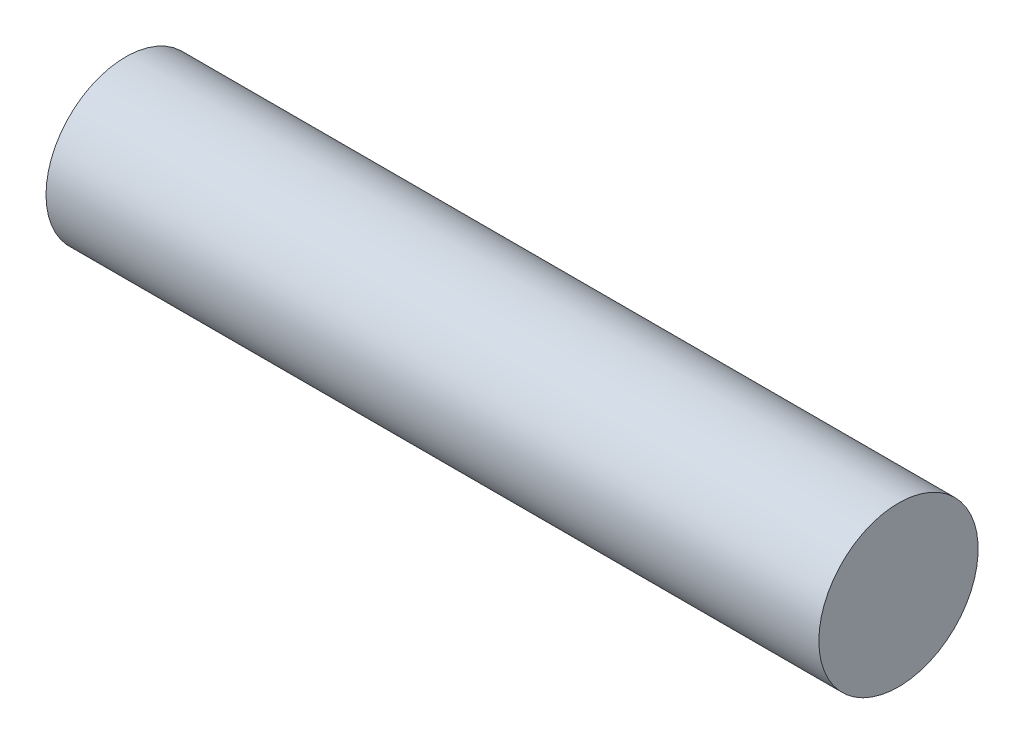
ISO-10303-21;
HEADER;
FILE_DESCRIPTION(('STEP AP214'),'2;1');
FILE_NAME('part.step','',(''),(''),'','','');
FILE_SCHEMA(('AUTOMOTIVE_DESIGN { 1 0 10303 214 1 1 1 1 }'));
ENDSEC;
DATA;
#1=APPLICATION_CONTEXT('core data for automotive mechanical design processes');
#2=APPLICATION_PROTOCOL_DEFINITION('international standard','automotive_design',2000,#1);
#3=PRODUCT_CONTEXT('',#1,'mechanical');
#4=PRODUCT('Part','Part','',(#3));
#5=PRODUCT_RELATED_PRODUCT_CATEGORY('part','',(#4));
#6=PRODUCT_DEFINITION_FORMATION('','',#4);
#7=PRODUCT_DEFINITION_CONTEXT('part definition',#1,'design');
#8=PRODUCT_DEFINITION('design','',#6,#7);
#9=PRODUCT_DEFINITION_SHAPE('','',#8);
#10=(LENGTH_UNIT() NAMED_UNIT(*) SI_UNIT(.MILLI.,.METRE.));
#11=(NAMED_UNIT(*) PLANE_ANGLE_UNIT() SI_UNIT($,.RADIAN.));
#12=(NAMED_UNIT(*) SI_UNIT($,.STERADIAN.) SOLID_ANGLE_UNIT());
#13=UNCERTAINTY_MEASURE_WITH_UNIT(LENGTH_MEASURE(1.E-05),#10,'distance_accuracy_value','');
#14=(GEOMETRIC_REPRESENTATION_CONTEXT(3) GLOBAL_UNCERTAINTY_ASSIGNED_CONTEXT((#13)) GLOBAL_UNIT_ASSIGNED_CONTEXT((#10,
#11,#12)) REPRESENTATION_CONTEXT('',''));
#15=CARTESIAN_POINT('',(0.,0.,0.));
#16=DIRECTION('',(0.,0.,1.));
#17=DIRECTION('',(1.,0.,0.));
#18=AXIS2_PLACEMENT_3D('',#15,#16,#17);
#19=CARTESIAN_POINT('',(1110.,13.4,0.));
#20=DIRECTION('',(1.,0.,0.));
#21=DIRECTION('',(0.,0.,-1.));
#22=AXIS2_PLACEMENT_3D('',#19,#20,#21);
#23=PLANE('',#22);
#24=CARTESIAN_POINT('',(1110.,0.,0.));
#25=DIRECTION('',(-1.,0.,0.));
#26=DIRECTION('',(0.,0.,1.));
#27=AXIS2_PLACEMENT_3D('',#24,#25,#26);
#28=CIRCLE('',#27,13.4);
#29=CARTESIAN_POINT('',(1110.,0.,13.4));
#30=VERTEX_POINT('',#29);
#31=EDGE_CURVE('E44',#30,#30,#28,.T.);
#32=ORIENTED_EDGE('',*,*,#31,.T.);
#33=EDGE_LOOP('',(#32));
#34=FACE_BOUND('',#33,.T.);
#35=ADVANCED_FACE('F39',(#34),#23,.F.);
#36=CARTESIAN_POINT('',(1240.,0.,0.));
#37=DIRECTION('',(-1.,0.,0.));
#38=DIRECTION('',(0.,0.,1.));
#39=AXIS2_PLACEMENT_3D('',#36,#37,#38);
#40=PLANE('',#39);
#41=CARTESIAN_POINT('',(1240.,0.,0.));
#42=DIRECTION('',(-1.,0.,0.));
#43=DIRECTION('',(0.,0.,1.));
#44=AXIS2_PLACEMENT_3D('',#41,#42,#43);
#45=CIRCLE('',#44,13.4);
#46=CARTESIAN_POINT('',(1240.,0.,13.4));
#47=VERTEX_POINT('',#46);
#48=EDGE_CURVE('E10',#47,#47,#45,.T.);
#49=ORIENTED_EDGE('',*,*,#48,.F.);
#50=EDGE_LOOP('',(#49));
#51=FACE_BOUND('',#50,.T.);
#52=ADVANCED_FACE('F53',(#51),#40,.F.);
#53=CARTESIAN_POINT('',(-3000.,0.,0.));
#54=DIRECTION('',(-1.,0.,0.));
#55=DIRECTION('',(0.,0.,1.));
#56=AXIS2_PLACEMENT_3D('',#53,#54,#55);
#57=CYLINDRICAL_SURFACE('',#56,13.4);
#58=ORIENTED_EDGE('',*,*,#31,.F.);
#59=EDGE_LOOP('',(#58));
#60=FACE_BOUND('',#59,.T.);
#61=ORIENTED_EDGE('',*,*,#48,.T.);
#62=EDGE_LOOP('',(#61));
#63=FACE_BOUND('',#62,.T.);
#64=ADVANCED_FACE('F55',(#60,#63),#57,.T.);
#65=CLOSED_SHELL('',(#35,#52,#64));
#66=MANIFOLD_SOLID_BREP('B2',#65);
#67=ADVANCED_BREP_SHAPE_REPRESENTATION('',(#18,#66),#14);
#68=SHAPE_DEFINITION_REPRESENTATION(#9,#67);
ENDSEC;
END-ISO-10303-21;
